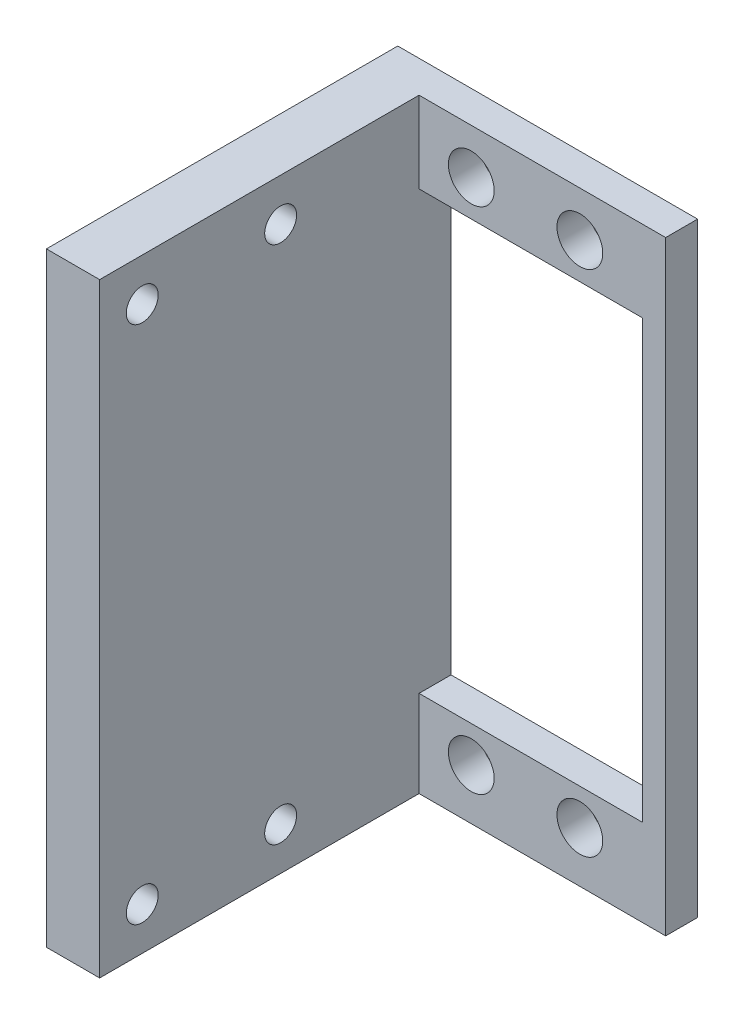
ISO-10303-21;
HEADER;
FILE_DESCRIPTION(('STEP AP214'),'2;1');
FILE_NAME('part.step','',(''),(''),'','','');
FILE_SCHEMA(('AUTOMOTIVE_DESIGN { 1 0 10303 214 1 1 1 1 }'));
ENDSEC;
DATA;
#1=APPLICATION_CONTEXT('core data for automotive mechanical design processes');
#2=APPLICATION_PROTOCOL_DEFINITION('international standard','automotive_design',2000,#1);
#3=PRODUCT_CONTEXT('',#1,'mechanical');
#4=PRODUCT('Part','Part','',(#3));
#5=PRODUCT_RELATED_PRODUCT_CATEGORY('part','',(#4));
#6=PRODUCT_DEFINITION_FORMATION('','',#4);
#7=PRODUCT_DEFINITION_CONTEXT('part definition',#1,'design');
#8=PRODUCT_DEFINITION('design','',#6,#7);
#9=PRODUCT_DEFINITION_SHAPE('','',#8);
#10=(LENGTH_UNIT() NAMED_UNIT(*) SI_UNIT(.MILLI.,.METRE.));
#11=(NAMED_UNIT(*) PLANE_ANGLE_UNIT() SI_UNIT($,.RADIAN.));
#12=(NAMED_UNIT(*) SI_UNIT($,.STERADIAN.) SOLID_ANGLE_UNIT());
#13=UNCERTAINTY_MEASURE_WITH_UNIT(LENGTH_MEASURE(1.E-05),#10,'distance_accuracy_value','');
#14=(GEOMETRIC_REPRESENTATION_CONTEXT(3) GLOBAL_UNCERTAINTY_ASSIGNED_CONTEXT((#13)) GLOBAL_UNIT_ASSIGNED_CONTEXT((#10,
#11,#12)) REPRESENTATION_CONTEXT('',''));
#15=CARTESIAN_POINT('',(0.,0.,0.));
#16=DIRECTION('',(0.,0.,1.));
#17=DIRECTION('',(1.,0.,0.));
#18=AXIS2_PLACEMENT_3D('',#15,#16,#17);
#19=CARTESIAN_POINT('',(-11.4535216616645,17.6096788638023,-3.));
#20=DIRECTION('',(0.,-1.,0.));
#21=DIRECTION('',(0.,0.,1.));
#22=AXIS2_PLACEMENT_3D('',#19,#20,#21);
#23=PLANE('',#22);
#24=DIRECTION('',(-1.,0.,0.));
#25=VECTOR('',#24,1.);
#26=CARTESIAN_POINT('',(-11.4535216616645,17.6096788638023,0.));
#27=LINE('',#26,#25);
#28=CARTESIAN_POINT('',(11.7043655919531,17.6096788638023,0.));
#29=VERTEX_POINT('',#28);
#30=CARTESIAN_POINT('',(-11.4535216616645,17.6096788638023,0.));
#31=VERTEX_POINT('',#30);
#32=EDGE_CURVE('E84',#29,#31,#27,.T.);
#33=ORIENTED_EDGE('',*,*,#32,.F.);
#34=DIRECTION('',(0.,0.,1.));
#35=VECTOR('',#34,1.);
#36=CARTESIAN_POINT('',(11.7043655919531,17.6096788638023,-3.));
#37=LINE('',#36,#35);
#38=CARTESIAN_POINT('',(11.7043655919531,17.6096788638023,-3.));
#39=VERTEX_POINT('',#38);
#40=EDGE_CURVE('E91',#39,#29,#37,.T.);
#41=ORIENTED_EDGE('',*,*,#40,.F.);
#42=DIRECTION('',(-1.,0.,0.));
#43=VECTOR('',#42,1.);
#44=CARTESIAN_POINT('',(-11.4535216616645,17.6096788638023,-3.));
#45=LINE('',#44,#43);
#46=CARTESIAN_POINT('',(-16.4535216616645,17.6096788638023,-3.));
#47=VERTEX_POINT('',#46);
#48=EDGE_CURVE('E88',#39,#47,#45,.T.);
#49=ORIENTED_EDGE('',*,*,#48,.T.);
#50=DIRECTION('',(0.,0.,1.));
#51=VECTOR('',#50,1.);
#52=CARTESIAN_POINT('',(-16.4535216616645,17.6096788638023,-3.));
#53=LINE('',#52,#51);
#54=CARTESIAN_POINT('',(-16.4535216616645,17.6096788638023,30.));
#55=VERTEX_POINT('',#54);
#56=EDGE_CURVE('E175',#47,#55,#53,.T.);
#57=ORIENTED_EDGE('',*,*,#56,.T.);
#58=DIRECTION('',(1.,0.,0.));
#59=VECTOR('',#58,1.);
#60=CARTESIAN_POINT('',(-11.4535216616645,17.6096788638023,30.));
#61=LINE('',#60,#59);
#62=CARTESIAN_POINT('',(-11.4535216616645,17.6096788638023,30.));
#63=VERTEX_POINT('',#62);
#64=EDGE_CURVE('E164',#55,#63,#61,.T.);
#65=ORIENTED_EDGE('',*,*,#64,.T.);
#66=DIRECTION('',(0.,0.,1.));
#67=VECTOR('',#66,1.);
#68=CARTESIAN_POINT('',(-11.4535216616645,17.6096788638023,-3.));
#69=LINE('',#68,#67);
#70=EDGE_CURVE('E99',#31,#63,#69,.T.);
#71=ORIENTED_EDGE('',*,*,#70,.F.);
#72=EDGE_LOOP('',(#33,#41,#49,#57,#65,#71));
#73=FACE_BOUND('',#72,.T.);
#74=ADVANCED_FACE('F35',(#73),#23,.F.);
#75=CARTESIAN_POINT('',(-11.4535216616645,-39.1935902800227,-3.));
#76=DIRECTION('',(0.,1.,0.));
#77=DIRECTION('',(0.,0.,-1.));
#78=AXIS2_PLACEMENT_3D('',#75,#76,#77);
#79=PLANE('',#78);
#80=DIRECTION('',(1.,0.,0.));
#81=VECTOR('',#80,1.);
#82=CARTESIAN_POINT('',(-11.4535216616645,-39.1935902800227,0.));
#83=LINE('',#82,#81);
#84=CARTESIAN_POINT('',(-11.4535216616645,-39.1935902800227,0.));
#85=VERTEX_POINT('',#84);
#86=CARTESIAN_POINT('',(11.7043655919531,-39.1935902800227,0.));
#87=VERTEX_POINT('',#86);
#88=EDGE_CURVE('E86',#85,#87,#83,.T.);
#89=ORIENTED_EDGE('',*,*,#88,.F.);
#90=DIRECTION('',(0.,0.,1.));
#91=VECTOR('',#90,1.);
#92=CARTESIAN_POINT('',(-11.4535216616645,-39.1935902800227,-3.));
#93=LINE('',#92,#91);
#94=CARTESIAN_POINT('',(-11.4535216616645,-39.1935902800227,30.));
#95=VERTEX_POINT('',#94);
#96=EDGE_CURVE('E172',#85,#95,#93,.T.);
#97=ORIENTED_EDGE('',*,*,#96,.T.);
#98=DIRECTION('',(-1.,0.,0.));
#99=VECTOR('',#98,1.);
#100=CARTESIAN_POINT('',(-11.4535216616645,-39.1935902800227,30.));
#101=LINE('',#100,#99);
#102=CARTESIAN_POINT('',(-16.4535216616645,-39.1935902800227,30.));
#103=VERTEX_POINT('',#102);
#104=EDGE_CURVE('E158',#95,#103,#101,.T.);
#105=ORIENTED_EDGE('',*,*,#104,.T.);
#106=DIRECTION('',(0.,0.,1.));
#107=VECTOR('',#106,1.);
#108=CARTESIAN_POINT('',(-16.4535216616645,-39.1935902800227,-3.));
#109=LINE('',#108,#107);
#110=CARTESIAN_POINT('',(-16.4535216616645,-39.1935902800227,-3.));
#111=VERTEX_POINT('',#110);
#112=EDGE_CURVE('E178',#111,#103,#109,.T.);
#113=ORIENTED_EDGE('',*,*,#112,.F.);
#114=DIRECTION('',(1.,0.,0.));
#115=VECTOR('',#114,1.);
#116=CARTESIAN_POINT('',(-11.4535216616645,-39.1935902800227,-3.));
#117=LINE('',#116,#115);
#118=CARTESIAN_POINT('',(11.7043655919531,-39.1935902800227,-3.));
#119=VERTEX_POINT('',#118);
#120=EDGE_CURVE('E202',#111,#119,#117,.T.);
#121=ORIENTED_EDGE('',*,*,#120,.T.);
#122=DIRECTION('',(0.,0.,1.));
#123=VECTOR('',#122,1.);
#124=CARTESIAN_POINT('',(11.7043655919531,-39.1935902800227,-3.));
#125=LINE('',#124,#123);
#126=EDGE_CURVE('E43',#119,#87,#125,.T.);
#127=ORIENTED_EDGE('',*,*,#126,.T.);
#128=EDGE_LOOP('',(#89,#97,#105,#113,#121,#127));
#129=FACE_BOUND('',#128,.T.);
#130=ADVANCED_FACE('F207',(#129),#79,.F.);
#131=CARTESIAN_POINT('',(11.7043655919531,17.6096788638023,-3.));
#132=DIRECTION('',(-1.,0.,0.));
#133=DIRECTION('',(0.,-1.,0.));
#134=AXIS2_PLACEMENT_3D('',#131,#132,#133);
#135=PLANE('',#134);
#136=DIRECTION('',(0.,1.,0.));
#137=VECTOR('',#136,1.);
#138=CARTESIAN_POINT('',(11.7043655919531,17.6096788638023,0.));
#139=LINE('',#138,#137);
#140=EDGE_CURVE('E79',#87,#29,#139,.T.);
#141=ORIENTED_EDGE('',*,*,#140,.F.);
#142=ORIENTED_EDGE('',*,*,#126,.F.);
#143=DIRECTION('',(0.,1.,0.));
#144=VECTOR('',#143,1.);
#145=CARTESIAN_POINT('',(11.7043655919531,17.6096788638023,-3.));
#146=LINE('',#145,#144);
#147=EDGE_CURVE('E60',#119,#39,#146,.T.);
#148=ORIENTED_EDGE('',*,*,#147,.T.);
#149=ORIENTED_EDGE('',*,*,#40,.T.);
#150=EDGE_LOOP('',(#141,#142,#148,#149));
#151=FACE_BOUND('',#150,.T.);
#152=ADVANCED_FACE('F92',(#151),#135,.F.);
#153=CARTESIAN_POINT('',(0.,0.,-3.));
#154=DIRECTION('',(0.,0.,1.));
#155=DIRECTION('',(-1.,0.,0.));
#156=AXIS2_PLACEMENT_3D('',#153,#154,#155);
#157=PLANE('',#156);
#158=CARTESIAN_POINT('',(-6.55352166166445,13.3725715818765,-3.));
#159=DIRECTION('',(0.,0.,-1.));
#160=DIRECTION('',(-1.,0.,0.));
#161=AXIS2_PLACEMENT_3D('',#158,#159,#160);
#162=CIRCLE('',#161,2.15);
#163=CARTESIAN_POINT('',(-8.70352166166446,13.3725715818765,-3.));
#164=VERTEX_POINT('',#163);
#165=EDGE_CURVE('E152',#164,#164,#162,.T.);
#166=ORIENTED_EDGE('',*,*,#165,.F.);
#167=EDGE_LOOP('',(#166));
#168=FACE_BOUND('',#167,.T.);
#169=CARTESIAN_POINT('',(3.64647833833554,-34.4274284181235,-3.));
#170=DIRECTION('',(0.,0.,-1.));
#171=DIRECTION('',(-1.,0.,0.));
#172=AXIS2_PLACEMENT_3D('',#169,#170,#171);
#173=CIRCLE('',#172,2.15);
#174=CARTESIAN_POINT('',(1.49647833833555,-34.4274284181235,-3.));
#175=VERTEX_POINT('',#174);
#176=EDGE_CURVE('E149',#175,#175,#173,.T.);
#177=ORIENTED_EDGE('',*,*,#176,.F.);
#178=EDGE_LOOP('',(#177));
#179=FACE_BOUND('',#178,.T.);
#180=CARTESIAN_POINT('',(-6.55352166166446,-34.4274284181235,-3.));
#181=DIRECTION('',(0.,0.,-1.));
#182=DIRECTION('',(-1.,0.,0.));
#183=AXIS2_PLACEMENT_3D('',#180,#181,#182);
#184=CIRCLE('',#183,2.15);
#185=CARTESIAN_POINT('',(-8.70352166166445,-34.4274284181235,-3.));
#186=VERTEX_POINT('',#185);
#187=EDGE_CURVE('E146',#186,#186,#184,.T.);
#188=ORIENTED_EDGE('',*,*,#187,.F.);
#189=EDGE_LOOP('',(#188));
#190=FACE_BOUND('',#189,.T.);
#191=CARTESIAN_POINT('',(3.64647833833554,13.3725715818765,-3.));
#192=DIRECTION('',(0.,0.,-1.));
#193=DIRECTION('',(-1.,0.,0.));
#194=AXIS2_PLACEMENT_3D('',#191,#192,#193);
#195=CIRCLE('',#194,2.15);
#196=CARTESIAN_POINT('',(1.49647833833554,13.3725715818765,-3.));
#197=VERTEX_POINT('',#196);
#198=EDGE_CURVE('E143',#197,#197,#195,.T.);
#199=ORIENTED_EDGE('',*,*,#198,.F.);
#200=EDGE_LOOP('',(#199));
#201=FACE_BOUND('',#200,.T.);
#202=DIRECTION('',(0.,-1.,0.));
#203=VECTOR('',#202,1.);
#204=CARTESIAN_POINT('',(-11.4535216616645,-39.1935902800227,-3.));
#205=LINE('',#204,#203);
#206=CARTESIAN_POINT('',(-11.4535216616645,9.98681562195004,-3.));
#207=VERTEX_POINT('',#206);
#208=CARTESIAN_POINT('',(-11.4535216616645,-31.041672458197,-3.));
#209=VERTEX_POINT('',#208);
#210=EDGE_CURVE('E166',#207,#209,#205,.T.);
#211=ORIENTED_EDGE('',*,*,#210,.T.);
#212=DIRECTION('',(1.,0.,0.));
#213=VECTOR('',#212,1.);
#214=CARTESIAN_POINT('',(9.52875763391757,-31.041672458197,-3.));
#215=LINE('',#214,#213);
#216=CARTESIAN_POINT('',(9.52875763391757,-31.041672458197,-3.));
#217=VERTEX_POINT('',#216);
#218=EDGE_CURVE('E174',#209,#217,#215,.T.);
#219=ORIENTED_EDGE('',*,*,#218,.T.);
#220=DIRECTION('',(0.,1.,0.));
#221=VECTOR('',#220,1.);
#222=CARTESIAN_POINT('',(9.52875763391757,-31.041672458197,-3.));
#223=LINE('',#222,#221);
#224=CARTESIAN_POINT('',(9.52875763391757,9.98681562195004,-3.));
#225=VERTEX_POINT('',#224);
#226=EDGE_CURVE('E191',#217,#225,#223,.T.);
#227=ORIENTED_EDGE('',*,*,#226,.T.);
#228=DIRECTION('',(-1.,0.,0.));
#229=VECTOR('',#228,1.);
#230=CARTESIAN_POINT('',(9.52875763391757,9.98681562195004,-3.));
#231=LINE('',#230,#229);
#232=EDGE_CURVE('E186',#225,#207,#231,.T.);
#233=ORIENTED_EDGE('',*,*,#232,.T.);
#234=EDGE_LOOP('',(#211,#219,#227,#233));
#235=FACE_BOUND('',#234,.T.);
#236=ORIENTED_EDGE('',*,*,#48,.F.);
#237=ORIENTED_EDGE('',*,*,#147,.F.);
#238=ORIENTED_EDGE('',*,*,#120,.F.);
#239=DIRECTION('',(0.,1.,0.));
#240=VECTOR('',#239,1.);
#241=CARTESIAN_POINT('',(-16.4535216616645,-39.1935902800227,-3.));
#242=LINE('',#241,#240);
#243=EDGE_CURVE('E169',#111,#47,#242,.T.);
#244=ORIENTED_EDGE('',*,*,#243,.T.);
#245=EDGE_LOOP('',(#236,#237,#238,#244));
#246=FACE_BOUND('',#245,.T.);
#247=ADVANCED_FACE('F210',(#168,#179,#190,#201,#235,#246),#157,.F.);
#248=CARTESIAN_POINT('',(0.,0.,0.));
#249=DIRECTION('',(0.,0.,1.));
#250=DIRECTION('',(-1.,0.,0.));
#251=AXIS2_PLACEMENT_3D('',#248,#249,#250);
#252=PLANE('',#251);
#253=CARTESIAN_POINT('',(-6.55352166166445,13.3725715818765,0.));
#254=DIRECTION('',(0.,0.,-1.));
#255=DIRECTION('',(-1.,0.,0.));
#256=AXIS2_PLACEMENT_3D('',#253,#254,#255);
#257=CIRCLE('',#256,2.15);
#258=CARTESIAN_POINT('',(-8.70352166166446,13.3725715818765,0.));
#259=VERTEX_POINT('',#258);
#260=EDGE_CURVE('E133',#259,#259,#257,.T.);
#261=ORIENTED_EDGE('',*,*,#260,.T.);
#262=EDGE_LOOP('',(#261));
#263=FACE_BOUND('',#262,.T.);
#264=CARTESIAN_POINT('',(3.64647833833554,-34.4274284181235,0.));
#265=DIRECTION('',(0.,0.,-1.));
#266=DIRECTION('',(-1.,0.,0.));
#267=AXIS2_PLACEMENT_3D('',#264,#265,#266);
#268=CIRCLE('',#267,2.15);
#269=CARTESIAN_POINT('',(1.49647833833555,-34.4274284181235,0.));
#270=VERTEX_POINT('',#269);
#271=EDGE_CURVE('E128',#270,#270,#268,.T.);
#272=ORIENTED_EDGE('',*,*,#271,.T.);
#273=EDGE_LOOP('',(#272));
#274=FACE_BOUND('',#273,.T.);
#275=CARTESIAN_POINT('',(-6.55352166166446,-34.4274284181235,0.));
#276=DIRECTION('',(0.,0.,-1.));
#277=DIRECTION('',(-1.,0.,0.));
#278=AXIS2_PLACEMENT_3D('',#275,#276,#277);
#279=CIRCLE('',#278,2.15);
#280=CARTESIAN_POINT('',(-8.70352166166445,-34.4274284181235,0.));
#281=VERTEX_POINT('',#280);
#282=EDGE_CURVE('E124',#281,#281,#279,.T.);
#283=ORIENTED_EDGE('',*,*,#282,.T.);
#284=EDGE_LOOP('',(#283));
#285=FACE_BOUND('',#284,.T.);
#286=CARTESIAN_POINT('',(3.64647833833554,13.3725715818765,0.));
#287=DIRECTION('',(0.,0.,-1.));
#288=DIRECTION('',(-1.,0.,0.));
#289=AXIS2_PLACEMENT_3D('',#286,#287,#288);
#290=CIRCLE('',#289,2.15);
#291=CARTESIAN_POINT('',(1.49647833833554,13.3725715818765,0.));
#292=VERTEX_POINT('',#291);
#293=EDGE_CURVE('E139',#292,#292,#290,.T.);
#294=ORIENTED_EDGE('',*,*,#293,.T.);
#295=EDGE_LOOP('',(#294));
#296=FACE_BOUND('',#295,.T.);
#297=DIRECTION('',(-1.,0.,0.));
#298=VECTOR('',#297,1.);
#299=CARTESIAN_POINT('',(9.52875763391757,9.98681562195004,0.));
#300=LINE('',#299,#298);
#301=CARTESIAN_POINT('',(9.52875763391757,9.98681562195004,0.));
#302=VERTEX_POINT('',#301);
#303=CARTESIAN_POINT('',(-11.4535216616645,9.98681562195004,0.));
#304=VERTEX_POINT('',#303);
#305=EDGE_CURVE('E185',#302,#304,#300,.T.);
#306=ORIENTED_EDGE('',*,*,#305,.F.);
#307=DIRECTION('',(0.,1.,0.));
#308=VECTOR('',#307,1.);
#309=CARTESIAN_POINT('',(9.52875763391757,-31.041672458197,0.));
#310=LINE('',#309,#308);
#311=CARTESIAN_POINT('',(9.52875763391757,-31.041672458197,0.));
#312=VERTEX_POINT('',#311);
#313=EDGE_CURVE('E183',#312,#302,#310,.T.);
#314=ORIENTED_EDGE('',*,*,#313,.F.);
#315=DIRECTION('',(-1.,0.,0.));
#316=VECTOR('',#315,1.);
#317=CARTESIAN_POINT('',(0.,-31.041672458197,0.));
#318=LINE('',#317,#316);
#319=CARTESIAN_POINT('',(-11.4535216616645,-31.041672458197,0.));
#320=VERTEX_POINT('',#319);
#321=EDGE_CURVE('E11',#312,#320,#318,.T.);
#322=ORIENTED_EDGE('',*,*,#321,.T.);
#323=DIRECTION('',(0.,-1.,0.));
#324=VECTOR('',#323,1.);
#325=CARTESIAN_POINT('',(-11.4535216616645,-39.1935902800227,0.));
#326=LINE('',#325,#324);
#327=EDGE_CURVE('E100',#320,#85,#326,.T.);
#328=ORIENTED_EDGE('',*,*,#327,.T.);
#329=ORIENTED_EDGE('',*,*,#88,.T.);
#330=ORIENTED_EDGE('',*,*,#140,.T.);
#331=ORIENTED_EDGE('',*,*,#32,.T.);
#332=EDGE_CURVE('E103',#31,#304,#326,.T.);
#333=ORIENTED_EDGE('',*,*,#332,.T.);
#334=EDGE_LOOP('',(#306,#314,#322,#328,#329,#330,#331,#333));
#335=FACE_BOUND('',#334,.T.);
#336=ADVANCED_FACE('F81',(#263,#274,#285,#296,#335),#252,.T.);
#337=CARTESIAN_POINT('',(9.52875763391757,9.98681562195004,0.));
#338=DIRECTION('',(0.,1.,0.));
#339=DIRECTION('',(-1.,0.,0.));
#340=AXIS2_PLACEMENT_3D('',#337,#338,#339);
#341=PLANE('',#340);
#342=ORIENTED_EDGE('',*,*,#305,.T.);
#343=DIRECTION('',(0.,0.,-1.));
#344=VECTOR('',#343,1.);
#345=CARTESIAN_POINT('',(-11.4535216616645,9.98681562195004,-3.));
#346=LINE('',#345,#344);
#347=EDGE_CURVE('E101',#304,#207,#346,.T.);
#348=ORIENTED_EDGE('',*,*,#347,.T.);
#349=ORIENTED_EDGE('',*,*,#232,.F.);
#350=DIRECTION('',(0.,0.,-1.));
#351=VECTOR('',#350,1.);
#352=CARTESIAN_POINT('',(9.52875763391757,9.98681562195004,0.));
#353=LINE('',#352,#351);
#354=EDGE_CURVE('E196',#302,#225,#353,.T.);
#355=ORIENTED_EDGE('',*,*,#354,.F.);
#356=EDGE_LOOP('',(#342,#348,#349,#355));
#357=FACE_BOUND('',#356,.T.);
#358=ADVANCED_FACE('F243',(#357),#341,.F.);
#359=CARTESIAN_POINT('',(9.52875763391757,-31.041672458197,0.));
#360=DIRECTION('',(0.,-1.,0.));
#361=DIRECTION('',(1.,0.,0.));
#362=AXIS2_PLACEMENT_3D('',#359,#360,#361);
#363=PLANE('',#362);
#364=ORIENTED_EDGE('',*,*,#218,.F.);
#365=DIRECTION('',(0.,0.,1.));
#366=VECTOR('',#365,1.);
#367=CARTESIAN_POINT('',(-11.4535216616645,-31.041672458197,-3.));
#368=LINE('',#367,#366);
#369=EDGE_CURVE('E106',#209,#320,#368,.T.);
#370=ORIENTED_EDGE('',*,*,#369,.T.);
#371=ORIENTED_EDGE('',*,*,#321,.F.);
#372=DIRECTION('',(0.,0.,-1.));
#373=VECTOR('',#372,1.);
#374=CARTESIAN_POINT('',(9.52875763391757,-31.041672458197,0.));
#375=LINE('',#374,#373);
#376=EDGE_CURVE('E51',#312,#217,#375,.T.);
#377=ORIENTED_EDGE('',*,*,#376,.T.);
#378=EDGE_LOOP('',(#364,#370,#371,#377));
#379=FACE_BOUND('',#378,.T.);
#380=ADVANCED_FACE('F249',(#379),#363,.F.);
#381=CARTESIAN_POINT('',(9.52875763391757,-31.041672458197,0.));
#382=DIRECTION('',(1.,0.,0.));
#383=DIRECTION('',(0.,0.,1.));
#384=AXIS2_PLACEMENT_3D('',#381,#382,#383);
#385=PLANE('',#384);
#386=ORIENTED_EDGE('',*,*,#226,.F.);
#387=ORIENTED_EDGE('',*,*,#376,.F.);
#388=ORIENTED_EDGE('',*,*,#313,.T.);
#389=ORIENTED_EDGE('',*,*,#354,.T.);
#390=EDGE_LOOP('',(#386,#387,#388,#389));
#391=FACE_BOUND('',#390,.T.);
#392=ADVANCED_FACE('F244',(#391),#385,.F.);
#393=CARTESIAN_POINT('',(-11.4535216616645,-39.1935902800227,-3.));
#394=DIRECTION('',(1.,0.,0.));
#395=DIRECTION('',(0.,0.,1.));
#396=AXIS2_PLACEMENT_3D('',#393,#394,#395);
#397=PLANE('',#396);
#398=CARTESIAN_POINT('',(-11.4535216616645,13.6096788638023,13.));
#399=DIRECTION('',(-1.,0.,0.));
#400=DIRECTION('',(0.,0.,1.));
#401=AXIS2_PLACEMENT_3D('',#398,#399,#400);
#402=CIRCLE('',#401,1.5);
#403=CARTESIAN_POINT('',(-11.4535216616645,13.6096788638023,14.5));
#404=VERTEX_POINT('',#403);
#405=EDGE_CURVE('E299',#404,#404,#402,.T.);
#406=ORIENTED_EDGE('',*,*,#405,.T.);
#407=EDGE_LOOP('',(#406));
#408=FACE_BOUND('',#407,.T.);
#409=CARTESIAN_POINT('',(-11.4535216616645,-35.1935902800227,26.));
#410=DIRECTION('',(-1.,0.,0.));
#411=DIRECTION('',(0.,0.,-1.));
#412=AXIS2_PLACEMENT_3D('',#409,#410,#411);
#413=CIRCLE('',#412,1.5);
#414=CARTESIAN_POINT('',(-11.4535216616645,-35.1935902800227,24.5));
#415=VERTEX_POINT('',#414);
#416=EDGE_CURVE('E303',#415,#415,#413,.T.);
#417=ORIENTED_EDGE('',*,*,#416,.T.);
#418=EDGE_LOOP('',(#417));
#419=FACE_BOUND('',#418,.T.);
#420=CARTESIAN_POINT('',(-11.4535216616645,-35.1935902800227,13.));
#421=DIRECTION('',(-1.,0.,0.));
#422=DIRECTION('',(0.,0.,-1.));
#423=AXIS2_PLACEMENT_3D('',#420,#421,#422);
#424=CIRCLE('',#423,1.5);
#425=CARTESIAN_POINT('',(-11.4535216616645,-35.1935902800227,11.5));
#426=VERTEX_POINT('',#425);
#427=EDGE_CURVE('E307',#426,#426,#424,.T.);
#428=ORIENTED_EDGE('',*,*,#427,.T.);
#429=EDGE_LOOP('',(#428));
#430=FACE_BOUND('',#429,.T.);
#431=CARTESIAN_POINT('',(-11.4535216616645,13.6096788638023,26.));
#432=DIRECTION('',(-1.,0.,0.));
#433=DIRECTION('',(0.,0.,1.));
#434=AXIS2_PLACEMENT_3D('',#431,#432,#433);
#435=CIRCLE('',#434,1.5);
#436=CARTESIAN_POINT('',(-11.4535216616645,13.6096788638023,27.5));
#437=VERTEX_POINT('',#436);
#438=EDGE_CURVE('E117',#437,#437,#435,.T.);
#439=ORIENTED_EDGE('',*,*,#438,.T.);
#440=EDGE_LOOP('',(#439));
#441=FACE_BOUND('',#440,.T.);
#442=ORIENTED_EDGE('',*,*,#70,.T.);
#443=DIRECTION('',(0.,-1.,0.));
#444=VECTOR('',#443,1.);
#445=CARTESIAN_POINT('',(-11.4535216616645,-39.1935902800227,30.));
#446=LINE('',#445,#444);
#447=EDGE_CURVE('E155',#63,#95,#446,.T.);
#448=ORIENTED_EDGE('',*,*,#447,.T.);
#449=ORIENTED_EDGE('',*,*,#96,.F.);
#450=ORIENTED_EDGE('',*,*,#327,.F.);
#451=ORIENTED_EDGE('',*,*,#369,.F.);
#452=ORIENTED_EDGE('',*,*,#210,.F.);
#453=ORIENTED_EDGE('',*,*,#347,.F.);
#454=ORIENTED_EDGE('',*,*,#332,.F.);
#455=EDGE_LOOP('',(#442,#448,#449,#450,#451,#452,#453,#454));
#456=FACE_BOUND('',#455,.T.);
#457=ADVANCED_FACE('F239',(#408,#419,#430,#441,#456),#397,.T.);
#458=CARTESIAN_POINT('',(-16.4535216616645,-39.1935902800227,-3.));
#459=DIRECTION('',(-1.,0.,0.));
#460=DIRECTION('',(0.,0.,-1.));
#461=AXIS2_PLACEMENT_3D('',#458,#459,#460);
#462=PLANE('',#461);
#463=CARTESIAN_POINT('',(-16.4535216616645,13.6096788638023,13.));
#464=DIRECTION('',(1.,0.,0.));
#465=DIRECTION('',(0.,0.,-1.));
#466=AXIS2_PLACEMENT_3D('',#463,#464,#465);
#467=CIRCLE('',#466,1.5);
#468=CARTESIAN_POINT('',(-16.4535216616645,13.6096788638023,11.5));
#469=VERTEX_POINT('',#468);
#470=EDGE_CURVE('E38',#469,#469,#467,.T.);
#471=ORIENTED_EDGE('',*,*,#470,.T.);
#472=EDGE_LOOP('',(#471));
#473=FACE_BOUND('',#472,.T.);
#474=CARTESIAN_POINT('',(-16.4535216616645,-35.1935902800227,26.));
#475=DIRECTION('',(1.,0.,0.));
#476=DIRECTION('',(0.,0.,-1.));
#477=AXIS2_PLACEMENT_3D('',#474,#475,#476);
#478=CIRCLE('',#477,1.5);
#479=CARTESIAN_POINT('',(-16.4535216616645,-35.1935902800227,24.5));
#480=VERTEX_POINT('',#479);
#481=EDGE_CURVE('E119',#480,#480,#478,.T.);
#482=ORIENTED_EDGE('',*,*,#481,.T.);
#483=EDGE_LOOP('',(#482));
#484=FACE_BOUND('',#483,.T.);
#485=CARTESIAN_POINT('',(-16.4535216616645,-35.1935902800227,13.));
#486=DIRECTION('',(1.,0.,0.));
#487=DIRECTION('',(0.,0.,-1.));
#488=AXIS2_PLACEMENT_3D('',#485,#486,#487);
#489=CIRCLE('',#488,1.5);
#490=CARTESIAN_POINT('',(-16.4535216616645,-35.1935902800227,11.5));
#491=VERTEX_POINT('',#490);
#492=EDGE_CURVE('E116',#491,#491,#489,.T.);
#493=ORIENTED_EDGE('',*,*,#492,.T.);
#494=EDGE_LOOP('',(#493));
#495=FACE_BOUND('',#494,.T.);
#496=CARTESIAN_POINT('',(-16.4535216616645,13.6096788638023,26.));
#497=DIRECTION('',(1.,0.,0.));
#498=DIRECTION('',(0.,0.,-1.));
#499=AXIS2_PLACEMENT_3D('',#496,#497,#498);
#500=CIRCLE('',#499,1.5);
#501=CARTESIAN_POINT('',(-16.4535216616645,13.6096788638023,24.5));
#502=VERTEX_POINT('',#501);
#503=EDGE_CURVE('E113',#502,#502,#500,.T.);
#504=ORIENTED_EDGE('',*,*,#503,.T.);
#505=EDGE_LOOP('',(#504));
#506=FACE_BOUND('',#505,.T.);
#507=ORIENTED_EDGE('',*,*,#56,.F.);
#508=ORIENTED_EDGE('',*,*,#243,.F.);
#509=ORIENTED_EDGE('',*,*,#112,.T.);
#510=DIRECTION('',(0.,1.,0.));
#511=VECTOR('',#510,1.);
#512=CARTESIAN_POINT('',(-16.4535216616645,-39.1935902800227,30.));
#513=LINE('',#512,#511);
#514=EDGE_CURVE('E161',#103,#55,#513,.T.);
#515=ORIENTED_EDGE('',*,*,#514,.T.);
#516=EDGE_LOOP('',(#507,#508,#509,#515));
#517=FACE_BOUND('',#516,.T.);
#518=ADVANCED_FACE('F257',(#473,#484,#495,#506,#517),#462,.T.);
#519=CARTESIAN_POINT('',(0.,0.,30.));
#520=DIRECTION('',(0.,0.,-1.));
#521=DIRECTION('',(1.,0.,0.));
#522=AXIS2_PLACEMENT_3D('',#519,#520,#521);
#523=PLANE('',#522);
#524=ORIENTED_EDGE('',*,*,#447,.F.);
#525=ORIENTED_EDGE('',*,*,#64,.F.);
#526=ORIENTED_EDGE('',*,*,#514,.F.);
#527=ORIENTED_EDGE('',*,*,#104,.F.);
#528=EDGE_LOOP('',(#524,#525,#526,#527));
#529=FACE_BOUND('',#528,.T.);
#530=ADVANCED_FACE('F259',(#529),#523,.F.);
#531=CARTESIAN_POINT('',(3.64647833833554,13.3725715818765,-10.));
#532=DIRECTION('',(0.,0.,1.));
#533=DIRECTION('',(-1.,0.,0.));
#534=AXIS2_PLACEMENT_3D('',#531,#532,#533);
#535=CYLINDRICAL_SURFACE('',#534,2.15);
#536=ORIENTED_EDGE('',*,*,#293,.F.);
#537=EDGE_LOOP('',(#536));
#538=FACE_BOUND('',#537,.T.);
#539=ORIENTED_EDGE('',*,*,#198,.T.);
#540=EDGE_LOOP('',(#539));
#541=FACE_BOUND('',#540,.T.);
#542=ADVANCED_FACE('F261',(#538,#541),#535,.F.);
#543=CARTESIAN_POINT('',(-6.55352166166446,-34.4274284181235,-10.));
#544=DIRECTION('',(0.,0.,1.));
#545=DIRECTION('',(-1.,0.,0.));
#546=AXIS2_PLACEMENT_3D('',#543,#544,#545);
#547=CYLINDRICAL_SURFACE('',#546,2.15);
#548=ORIENTED_EDGE('',*,*,#282,.F.);
#549=EDGE_LOOP('',(#548));
#550=FACE_BOUND('',#549,.T.);
#551=ORIENTED_EDGE('',*,*,#187,.T.);
#552=EDGE_LOOP('',(#551));
#553=FACE_BOUND('',#552,.T.);
#554=ADVANCED_FACE('F267',(#550,#553),#547,.F.);
#555=CARTESIAN_POINT('',(3.64647833833554,-34.4274284181235,-10.));
#556=DIRECTION('',(0.,0.,1.));
#557=DIRECTION('',(-1.,0.,0.));
#558=AXIS2_PLACEMENT_3D('',#555,#556,#557);
#559=CYLINDRICAL_SURFACE('',#558,2.15);
#560=ORIENTED_EDGE('',*,*,#271,.F.);
#561=EDGE_LOOP('',(#560));
#562=FACE_BOUND('',#561,.T.);
#563=ORIENTED_EDGE('',*,*,#176,.T.);
#564=EDGE_LOOP('',(#563));
#565=FACE_BOUND('',#564,.T.);
#566=ADVANCED_FACE('F326',(#562,#565),#559,.F.);
#567=CARTESIAN_POINT('',(-6.55352166166445,13.3725715818765,-10.));
#568=DIRECTION('',(0.,0.,1.));
#569=DIRECTION('',(-1.,0.,0.));
#570=AXIS2_PLACEMENT_3D('',#567,#568,#569);
#571=CYLINDRICAL_SURFACE('',#570,2.15);
#572=ORIENTED_EDGE('',*,*,#260,.F.);
#573=EDGE_LOOP('',(#572));
#574=FACE_BOUND('',#573,.T.);
#575=ORIENTED_EDGE('',*,*,#165,.T.);
#576=EDGE_LOOP('',(#575));
#577=FACE_BOUND('',#576,.T.);
#578=ADVANCED_FACE('F316',(#574,#577),#571,.F.);
#579=CARTESIAN_POINT('',(-21.4535216616645,13.6096788638023,26.));
#580=DIRECTION('',(1.,0.,0.));
#581=DIRECTION('',(0.,0.,1.));
#582=AXIS2_PLACEMENT_3D('',#579,#580,#581);
#583=CYLINDRICAL_SURFACE('',#582,1.5);
#584=ORIENTED_EDGE('',*,*,#503,.F.);
#585=EDGE_LOOP('',(#584));
#586=FACE_BOUND('',#585,.T.);
#587=ORIENTED_EDGE('',*,*,#438,.F.);
#588=EDGE_LOOP('',(#587));
#589=FACE_BOUND('',#588,.T.);
#590=ADVANCED_FACE('F313',(#586,#589),#583,.F.);
#591=CARTESIAN_POINT('',(-21.4535216616645,-35.1935902800227,13.));
#592=DIRECTION('',(1.,0.,0.));
#593=DIRECTION('',(0.,0.,1.));
#594=AXIS2_PLACEMENT_3D('',#591,#592,#593);
#595=CYLINDRICAL_SURFACE('',#594,1.5);
#596=ORIENTED_EDGE('',*,*,#492,.F.);
#597=EDGE_LOOP('',(#596));
#598=FACE_BOUND('',#597,.T.);
#599=ORIENTED_EDGE('',*,*,#427,.F.);
#600=EDGE_LOOP('',(#599));
#601=FACE_BOUND('',#600,.T.);
#602=ADVANCED_FACE('F315',(#598,#601),#595,.F.);
#603=CARTESIAN_POINT('',(-21.4535216616645,-35.1935902800227,26.));
#604=DIRECTION('',(1.,0.,0.));
#605=DIRECTION('',(0.,0.,1.));
#606=AXIS2_PLACEMENT_3D('',#603,#604,#605);
#607=CYLINDRICAL_SURFACE('',#606,1.5);
#608=ORIENTED_EDGE('',*,*,#481,.F.);
#609=EDGE_LOOP('',(#608));
#610=FACE_BOUND('',#609,.T.);
#611=ORIENTED_EDGE('',*,*,#416,.F.);
#612=EDGE_LOOP('',(#611));
#613=FACE_BOUND('',#612,.T.);
#614=ADVANCED_FACE('F323',(#610,#613),#607,.F.);
#615=CARTESIAN_POINT('',(-21.4535216616645,13.6096788638023,13.));
#616=DIRECTION('',(1.,0.,0.));
#617=DIRECTION('',(0.,0.,1.));
#618=AXIS2_PLACEMENT_3D('',#615,#616,#617);
#619=CYLINDRICAL_SURFACE('',#618,1.5);
#620=ORIENTED_EDGE('',*,*,#470,.F.);
#621=EDGE_LOOP('',(#620));
#622=FACE_BOUND('',#621,.T.);
#623=ORIENTED_EDGE('',*,*,#405,.F.);
#624=EDGE_LOOP('',(#623));
#625=FACE_BOUND('',#624,.T.);
#626=ADVANCED_FACE('F379',(#622,#625),#619,.F.);
#627=CLOSED_SHELL('',(#74,#130,#152,#247,#336,#358,#380,#392,#457,#518,#530,#542,#554,#566,#578,
#590,#602,#614,#626));
#628=MANIFOLD_SOLID_BREP('B2',#627);
#629=ADVANCED_BREP_SHAPE_REPRESENTATION('',(#18,#628),#14);
#630=SHAPE_DEFINITION_REPRESENTATION(#9,#629);
ENDSEC;
END-ISO-10303-21;
